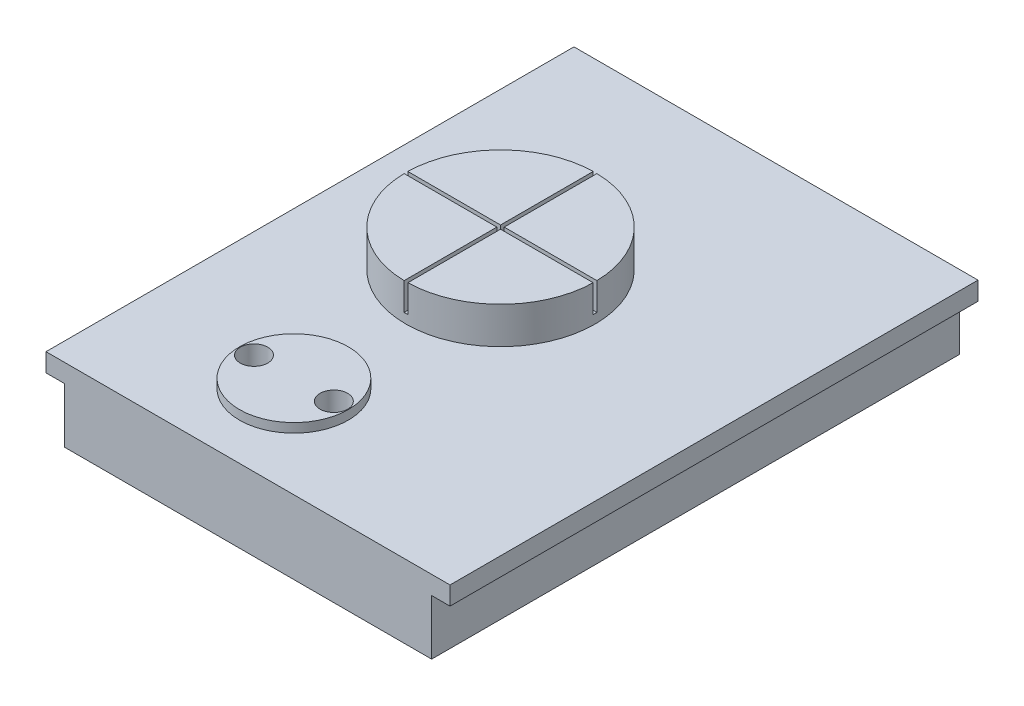
ISO-10303-21;
HEADER;
FILE_DESCRIPTION(('STEP AP214'),'2;1');
FILE_NAME('part.step','',(''),(''),'','','');
FILE_SCHEMA(('AUTOMOTIVE_DESIGN { 1 0 10303 214 1 1 1 1 }'));
ENDSEC;
DATA;
#1=APPLICATION_CONTEXT('core data for automotive mechanical design processes');
#2=APPLICATION_PROTOCOL_DEFINITION('international standard','automotive_design',2000,#1);
#3=PRODUCT_CONTEXT('',#1,'mechanical');
#4=PRODUCT('Part','Part','',(#3));
#5=PRODUCT_RELATED_PRODUCT_CATEGORY('part','',(#4));
#6=PRODUCT_DEFINITION_FORMATION('','',#4);
#7=PRODUCT_DEFINITION_CONTEXT('part definition',#1,'design');
#8=PRODUCT_DEFINITION('design','',#6,#7);
#9=PRODUCT_DEFINITION_SHAPE('','',#8);
#10=(LENGTH_UNIT() NAMED_UNIT(*) SI_UNIT(.MILLI.,.METRE.));
#11=(NAMED_UNIT(*) PLANE_ANGLE_UNIT() SI_UNIT($,.RADIAN.));
#12=(NAMED_UNIT(*) SI_UNIT($,.STERADIAN.) SOLID_ANGLE_UNIT());
#13=UNCERTAINTY_MEASURE_WITH_UNIT(LENGTH_MEASURE(1.E-05),#10,'distance_accuracy_value','');
#14=(GEOMETRIC_REPRESENTATION_CONTEXT(3) GLOBAL_UNCERTAINTY_ASSIGNED_CONTEXT((#13)) GLOBAL_UNIT_ASSIGNED_CONTEXT((#10,
#11,#12)) REPRESENTATION_CONTEXT('',''));
#15=CARTESIAN_POINT('',(0.,0.,0.));
#16=DIRECTION('',(0.,0.,1.));
#17=DIRECTION('',(1.,0.,0.));
#18=AXIS2_PLACEMENT_3D('',#15,#16,#17);
#19=CARTESIAN_POINT('',(0.,4.,-22.5));
#20=DIRECTION('',(0.,-1.,0.));
#21=DIRECTION('',(0.,0.,-1.));
#22=AXIS2_PLACEMENT_3D('',#19,#20,#21);
#23=CYLINDRICAL_SURFACE('',#22,10.3);
#24=CARTESIAN_POINT('',(0.,4.,-22.5));
#25=DIRECTION('',(0.,1.,0.));
#26=DIRECTION('',(0.,0.,1.));
#27=AXIS2_PLACEMENT_3D('',#24,#25,#26);
#28=CIRCLE('',#27,10.3);
#29=CARTESIAN_POINT('',(0.2,4.,-12.2019419306357));
#30=VERTEX_POINT('',#29);
#31=CARTESIAN_POINT('',(10.2980580693643,4.,-22.3));
#32=VERTEX_POINT('',#31);
#33=EDGE_CURVE('E277',#30,#32,#28,.T.);
#34=ORIENTED_EDGE('',*,*,#33,.F.);
#35=DIRECTION('',(0.,-1.,0.));
#36=VECTOR('',#35,1.);
#37=CARTESIAN_POINT('',(0.2,4.,-12.2019419306357));
#38=LINE('',#37,#36);
#39=CARTESIAN_POINT('',(0.2,1.,-12.2019419306357));
#40=VERTEX_POINT('',#39);
#41=EDGE_CURVE('E343',#30,#40,#38,.T.);
#42=ORIENTED_EDGE('',*,*,#41,.T.);
#43=CARTESIAN_POINT('',(0.,1.,-22.5));
#44=DIRECTION('',(0.,-1.,0.));
#45=DIRECTION('',(0.,0.,-1.));
#46=AXIS2_PLACEMENT_3D('',#43,#44,#45);
#47=CIRCLE('',#46,10.3);
#48=CARTESIAN_POINT('',(-0.2,1.,-12.2019419306357));
#49=VERTEX_POINT('',#48);
#50=EDGE_CURVE('E12',#40,#49,#47,.T.);
#51=ORIENTED_EDGE('',*,*,#50,.T.);
#52=DIRECTION('',(0.,-1.,0.));
#53=VECTOR('',#52,1.);
#54=CARTESIAN_POINT('',(-0.2,4.,-12.2019419306357));
#55=LINE('',#54,#53);
#56=CARTESIAN_POINT('',(-0.2,4.,-12.2019419306357));
#57=VERTEX_POINT('',#56);
#58=EDGE_CURVE('E346',#57,#49,#55,.T.);
#59=ORIENTED_EDGE('',*,*,#58,.F.);
#60=CARTESIAN_POINT('',(-10.2980580693643,4.,-22.3));
#61=VERTEX_POINT('',#60);
#62=EDGE_CURVE('E306',#61,#57,#28,.T.);
#63=ORIENTED_EDGE('',*,*,#62,.F.);
#64=DIRECTION('',(0.,-1.,0.));
#65=VECTOR('',#64,1.);
#66=CARTESIAN_POINT('',(-10.2980580693643,4.,-22.3));
#67=LINE('',#66,#65);
#68=CARTESIAN_POINT('',(-10.2980580693643,1.,-22.3));
#69=VERTEX_POINT('',#68);
#70=EDGE_CURVE('E350',#61,#69,#67,.T.);
#71=ORIENTED_EDGE('',*,*,#70,.T.);
#72=CARTESIAN_POINT('',(-10.2980580693643,1.,-22.7));
#73=VERTEX_POINT('',#72);
#74=EDGE_CURVE('E231',#69,#73,#47,.T.);
#75=ORIENTED_EDGE('',*,*,#74,.T.);
#76=DIRECTION('',(0.,-1.,0.));
#77=VECTOR('',#76,1.);
#78=CARTESIAN_POINT('',(-10.2980580693643,4.,-22.7));
#79=LINE('',#78,#77);
#80=CARTESIAN_POINT('',(-10.2980580693643,4.,-22.7));
#81=VERTEX_POINT('',#80);
#82=EDGE_CURVE('E348',#81,#73,#79,.T.);
#83=ORIENTED_EDGE('',*,*,#82,.F.);
#84=CARTESIAN_POINT('',(-0.2,4.,-32.7980580693643));
#85=VERTEX_POINT('',#84);
#86=EDGE_CURVE('E228',#85,#81,#28,.T.);
#87=ORIENTED_EDGE('',*,*,#86,.F.);
#88=DIRECTION('',(0.,-1.,0.));
#89=VECTOR('',#88,1.);
#90=CARTESIAN_POINT('',(-0.2,4.,-32.7980580693643));
#91=LINE('',#90,#89);
#92=CARTESIAN_POINT('',(-0.2,1.,-32.7980580693643));
#93=VERTEX_POINT('',#92);
#94=EDGE_CURVE('E209',#93,#85,#91,.F.);
#95=ORIENTED_EDGE('',*,*,#94,.F.);
#96=CARTESIAN_POINT('',(0.2,1.,-32.7980580693643));
#97=VERTEX_POINT('',#96);
#98=EDGE_CURVE('E72',#93,#97,#47,.T.);
#99=ORIENTED_EDGE('',*,*,#98,.T.);
#100=DIRECTION('',(0.,-1.,0.));
#101=VECTOR('',#100,1.);
#102=CARTESIAN_POINT('',(0.2,4.,-32.7980580693643));
#103=LINE('',#102,#101);
#104=CARTESIAN_POINT('',(0.2,4.,-32.7980580693643));
#105=VERTEX_POINT('',#104);
#106=EDGE_CURVE('E326',#97,#105,#103,.F.);
#107=ORIENTED_EDGE('',*,*,#106,.T.);
#108=CARTESIAN_POINT('',(10.2980580693643,4.,-22.7));
#109=VERTEX_POINT('',#108);
#110=EDGE_CURVE('E395',#109,#105,#28,.T.);
#111=ORIENTED_EDGE('',*,*,#110,.F.);
#112=DIRECTION('',(0.,-1.,0.));
#113=VECTOR('',#112,1.);
#114=CARTESIAN_POINT('',(10.2980580693643,4.,-22.7));
#115=LINE('',#114,#113);
#116=CARTESIAN_POINT('',(10.2980580693643,1.,-22.7));
#117=VERTEX_POINT('',#116);
#118=EDGE_CURVE('E79',#117,#109,#115,.F.);
#119=ORIENTED_EDGE('',*,*,#118,.F.);
#120=CARTESIAN_POINT('',(10.2980580693643,1.,-22.3));
#121=VERTEX_POINT('',#120);
#122=EDGE_CURVE('E67',#117,#121,#47,.T.);
#123=ORIENTED_EDGE('',*,*,#122,.T.);
#124=DIRECTION('',(0.,-1.,0.));
#125=VECTOR('',#124,1.);
#126=CARTESIAN_POINT('',(10.2980580693643,4.,-22.3));
#127=LINE('',#126,#125);
#128=EDGE_CURVE('E353',#121,#32,#127,.F.);
#129=ORIENTED_EDGE('',*,*,#128,.T.);
#130=EDGE_LOOP('',(#34,#42,#51,#59,#63,#71,#75,#83,#87,#95,#99,#107,#111,#119,#123,#129));
#131=FACE_BOUND('',#130,.T.);
#132=CARTESIAN_POINT('',(0.,0.,-22.5));
#133=DIRECTION('',(0.,1.,0.));
#134=DIRECTION('',(0.,0.,1.));
#135=AXIS2_PLACEMENT_3D('',#132,#133,#134);
#136=CIRCLE('',#135,10.3);
#137=CARTESIAN_POINT('',(0.,0.,-12.2));
#138=VERTEX_POINT('',#137);
#139=EDGE_CURVE('E303',#138,#138,#136,.T.);
#140=ORIENTED_EDGE('',*,*,#139,.T.);
#141=EDGE_LOOP('',(#140));
#142=FACE_BOUND('',#141,.T.);
#143=ADVANCED_FACE('F63',(#131,#142),#23,.T.);
#144=CARTESIAN_POINT('',(0.,4.,0.));
#145=DIRECTION('',(0.,1.,0.));
#146=DIRECTION('',(0.,0.,1.));
#147=AXIS2_PLACEMENT_3D('',#144,#145,#146);
#148=PLANE('',#147);
#149=DIRECTION('',(1.,0.,0.));
#150=VECTOR('',#149,1.);
#151=CARTESIAN_POINT('',(0.,4.,-22.7));
#152=LINE('',#151,#150);
#153=CARTESIAN_POINT('',(-0.200000000000001,4.,-22.7));
#154=VERTEX_POINT('',#153);
#155=EDGE_CURVE('E220',#81,#154,#152,.T.);
#156=ORIENTED_EDGE('',*,*,#155,.T.);
#157=DIRECTION('',(0.,0.,-1.));
#158=VECTOR('',#157,1.);
#159=CARTESIAN_POINT('',(-0.2,4.,-12.2));
#160=LINE('',#159,#158);
#161=EDGE_CURVE('E203',#154,#85,#160,.T.);
#162=ORIENTED_EDGE('',*,*,#161,.T.);
#163=ORIENTED_EDGE('',*,*,#86,.T.);
#164=EDGE_LOOP('',(#156,#162,#163));
#165=FACE_BOUND('',#164,.T.);
#166=ADVANCED_FACE('F227',(#165),#148,.T.);
#167=ORIENTED_EDGE('',*,*,#62,.T.);
#168=DIRECTION('',(0.,0.,-1.));
#169=VECTOR('',#168,1.);
#170=CARTESIAN_POINT('',(-0.2,4.,0.));
#171=LINE('',#170,#169);
#172=CARTESIAN_POINT('',(-0.2,4.,-22.3));
#173=VERTEX_POINT('',#172);
#174=EDGE_CURVE('E229',#57,#173,#171,.T.);
#175=ORIENTED_EDGE('',*,*,#174,.T.);
#176=DIRECTION('',(1.,0.,0.));
#177=VECTOR('',#176,1.);
#178=CARTESIAN_POINT('',(0.,4.,-22.3));
#179=LINE('',#178,#177);
#180=EDGE_CURVE('E233',#61,#173,#179,.T.);
#181=ORIENTED_EDGE('',*,*,#180,.F.);
#182=EDGE_LOOP('',(#167,#175,#181));
#183=FACE_BOUND('',#182,.T.);
#184=ADVANCED_FACE('F424',(#183),#148,.T.);
#185=DIRECTION('',(0.,0.,-1.));
#186=VECTOR('',#185,1.);
#187=CARTESIAN_POINT('',(0.2,4.,0.));
#188=LINE('',#187,#186);
#189=CARTESIAN_POINT('',(0.200000000000001,4.,-22.3));
#190=VERTEX_POINT('',#189);
#191=EDGE_CURVE('E237',#30,#190,#188,.T.);
#192=ORIENTED_EDGE('',*,*,#191,.F.);
#193=ORIENTED_EDGE('',*,*,#33,.T.);
#194=DIRECTION('',(1.,0.,0.));
#195=VECTOR('',#194,1.);
#196=CARTESIAN_POINT('',(-10.3,4.,-22.3));
#197=LINE('',#196,#195);
#198=EDGE_CURVE('E374',#190,#32,#197,.T.);
#199=ORIENTED_EDGE('',*,*,#198,.F.);
#200=EDGE_LOOP('',(#192,#193,#199));
#201=FACE_BOUND('',#200,.T.);
#202=ADVANCED_FACE('F402',(#201),#148,.T.);
#203=CARTESIAN_POINT('',(-4.35,-8.,0.));
#204=DIRECTION('',(0.,1.,0.));
#205=DIRECTION('',(0.,0.,1.));
#206=AXIS2_PLACEMENT_3D('',#203,#204,#205);
#207=CYLINDRICAL_SURFACE('',#206,1.5);
#208=CARTESIAN_POINT('',(-4.35,1.,0.));
#209=DIRECTION('',(0.,1.,0.));
#210=DIRECTION('',(0.,0.,1.));
#211=AXIS2_PLACEMENT_3D('',#208,#209,#210);
#212=CIRCLE('',#211,1.5);
#213=CARTESIAN_POINT('',(-4.35,1.,1.5));
#214=VERTEX_POINT('',#213);
#215=EDGE_CURVE('E313',#214,#214,#212,.T.);
#216=ORIENTED_EDGE('',*,*,#215,.T.);
#217=EDGE_LOOP('',(#216));
#218=FACE_BOUND('',#217,.T.);
#219=CARTESIAN_POINT('',(-4.35,-2.,0.));
#220=DIRECTION('',(0.,-1.,0.));
#221=DIRECTION('',(0.,0.,-1.));
#222=AXIS2_PLACEMENT_3D('',#219,#220,#221);
#223=CIRCLE('',#222,1.5);
#224=CARTESIAN_POINT('',(-4.35,-2.,-1.5));
#225=VERTEX_POINT('',#224);
#226=EDGE_CURVE('E335',#225,#225,#223,.F.);
#227=ORIENTED_EDGE('',*,*,#226,.F.);
#228=EDGE_LOOP('',(#227));
#229=FACE_BOUND('',#228,.T.);
#230=ADVANCED_FACE('F456',(#218,#229),#207,.F.);
#231=CARTESIAN_POINT('',(4.35,-8.,0.));
#232=DIRECTION('',(0.,1.,0.));
#233=DIRECTION('',(0.,0.,1.));
#234=AXIS2_PLACEMENT_3D('',#231,#232,#233);
#235=CYLINDRICAL_SURFACE('',#234,1.5);
#236=CARTESIAN_POINT('',(4.35,1.,0.));
#237=DIRECTION('',(0.,1.,0.));
#238=DIRECTION('',(0.,0.,1.));
#239=AXIS2_PLACEMENT_3D('',#236,#237,#238);
#240=CIRCLE('',#239,1.5);
#241=CARTESIAN_POINT('',(4.35,1.,1.5));
#242=VERTEX_POINT('',#241);
#243=EDGE_CURVE('E317',#242,#242,#240,.T.);
#244=ORIENTED_EDGE('',*,*,#243,.T.);
#245=EDGE_LOOP('',(#244));
#246=FACE_BOUND('',#245,.T.);
#247=CARTESIAN_POINT('',(4.35,-2.,0.));
#248=DIRECTION('',(0.,-1.,0.));
#249=DIRECTION('',(0.,0.,-1.));
#250=AXIS2_PLACEMENT_3D('',#247,#248,#249);
#251=CIRCLE('',#250,1.5);
#252=CARTESIAN_POINT('',(4.35,-2.,-1.5));
#253=VERTEX_POINT('',#252);
#254=EDGE_CURVE('E325',#253,#253,#251,.F.);
#255=ORIENTED_EDGE('',*,*,#254,.F.);
#256=EDGE_LOOP('',(#255));
#257=FACE_BOUND('',#256,.T.);
#258=ADVANCED_FACE('F453',(#246,#257),#235,.F.);
#259=CARTESIAN_POINT('',(0.,-8.,10.));
#260=DIRECTION('',(0.,0.,1.));
#261=DIRECTION('',(1.,0.,0.));
#262=AXIS2_PLACEMENT_3D('',#259,#260,#261);
#263=PLANE('',#262);
#264=DIRECTION('',(1.,0.,0.));
#265=VECTOR('',#264,1.);
#266=CARTESIAN_POINT('',(0.,0.,10.));
#267=LINE('',#266,#265);
#268=CARTESIAN_POINT('',(-17.,0.,10.));
#269=VERTEX_POINT('',#268);
#270=CARTESIAN_POINT('',(27.,0.,10.));
#271=VERTEX_POINT('',#270);
#272=EDGE_CURVE('E254',#269,#271,#267,.T.);
#273=ORIENTED_EDGE('',*,*,#272,.F.);
#274=DIRECTION('',(0.,1.,0.));
#275=VECTOR('',#274,1.);
#276=CARTESIAN_POINT('',(-17.,-2.,10.));
#277=LINE('',#276,#275);
#278=CARTESIAN_POINT('',(-17.,-2.,10.));
#279=VERTEX_POINT('',#278);
#280=EDGE_CURVE('E287',#279,#269,#277,.T.);
#281=ORIENTED_EDGE('',*,*,#280,.F.);
#282=DIRECTION('',(1.,0.,0.));
#283=VECTOR('',#282,1.);
#284=CARTESIAN_POINT('',(0.,-2.,10.));
#285=LINE('',#284,#283);
#286=CARTESIAN_POINT('',(-15.,-2.,10.));
#287=VERTEX_POINT('',#286);
#288=EDGE_CURVE('E298',#279,#287,#285,.T.);
#289=ORIENTED_EDGE('',*,*,#288,.T.);
#290=DIRECTION('',(0.,1.,0.));
#291=VECTOR('',#290,1.);
#292=CARTESIAN_POINT('',(-15.,-8.,10.));
#293=LINE('',#292,#291);
#294=CARTESIAN_POINT('',(-15.,-8.,10.));
#295=VERTEX_POINT('',#294);
#296=EDGE_CURVE('E239',#295,#287,#293,.T.);
#297=ORIENTED_EDGE('',*,*,#296,.F.);
#298=DIRECTION('',(1.,0.,0.));
#299=VECTOR('',#298,1.);
#300=CARTESIAN_POINT('',(0.,-8.,10.));
#301=LINE('',#300,#299);
#302=CARTESIAN_POINT('',(25.,-8.,10.));
#303=VERTEX_POINT('',#302);
#304=EDGE_CURVE('E253',#295,#303,#301,.T.);
#305=ORIENTED_EDGE('',*,*,#304,.T.);
#306=DIRECTION('',(0.,1.,0.));
#307=VECTOR('',#306,1.);
#308=CARTESIAN_POINT('',(25.,-8.,10.));
#309=LINE('',#308,#307);
#310=CARTESIAN_POINT('',(25.,-2.,10.));
#311=VERTEX_POINT('',#310);
#312=EDGE_CURVE('E240',#303,#311,#309,.T.);
#313=ORIENTED_EDGE('',*,*,#312,.T.);
#314=DIRECTION('',(1.,0.,0.));
#315=VECTOR('',#314,1.);
#316=CARTESIAN_POINT('',(0.,-2.,10.));
#317=LINE('',#316,#315);
#318=CARTESIAN_POINT('',(27.,-2.,10.));
#319=VERTEX_POINT('',#318);
#320=EDGE_CURVE('E276',#311,#319,#317,.T.);
#321=ORIENTED_EDGE('',*,*,#320,.T.);
#322=DIRECTION('',(0.,1.,0.));
#323=VECTOR('',#322,1.);
#324=CARTESIAN_POINT('',(27.,-2.,10.));
#325=LINE('',#324,#323);
#326=EDGE_CURVE('E265',#319,#271,#325,.T.);
#327=ORIENTED_EDGE('',*,*,#326,.T.);
#328=EDGE_LOOP('',(#273,#281,#289,#297,#305,#313,#321,#327));
#329=FACE_BOUND('',#328,.T.);
#330=ADVANCED_FACE('F65',(#329),#263,.T.);
#331=CARTESIAN_POINT('',(-15.,-8.,0.));
#332=DIRECTION('',(1.,0.,0.));
#333=DIRECTION('',(0.,0.,-1.));
#334=AXIS2_PLACEMENT_3D('',#331,#332,#333);
#335=PLANE('',#334);
#336=ORIENTED_EDGE('',*,*,#296,.T.);
#337=DIRECTION('',(0.,0.,-1.));
#338=VECTOR('',#337,1.);
#339=CARTESIAN_POINT('',(-15.,-2.,0.));
#340=LINE('',#339,#338);
#341=CARTESIAN_POINT('',(-15.,-2.,-47.5));
#342=VERTEX_POINT('',#341);
#343=EDGE_CURVE('E296',#287,#342,#340,.T.);
#344=ORIENTED_EDGE('',*,*,#343,.T.);
#345=DIRECTION('',(0.,1.,0.));
#346=VECTOR('',#345,1.);
#347=CARTESIAN_POINT('',(-15.,-8.,-47.5));
#348=LINE('',#347,#346);
#349=CARTESIAN_POINT('',(-15.,-8.,-47.5));
#350=VERTEX_POINT('',#349);
#351=EDGE_CURVE('E246',#350,#342,#348,.T.);
#352=ORIENTED_EDGE('',*,*,#351,.F.);
#353=DIRECTION('',(0.,0.,-1.));
#354=VECTOR('',#353,1.);
#355=CARTESIAN_POINT('',(-15.,-8.,0.));
#356=LINE('',#355,#354);
#357=EDGE_CURVE('E244',#295,#350,#356,.T.);
#358=ORIENTED_EDGE('',*,*,#357,.F.);
#359=EDGE_LOOP('',(#336,#344,#352,#358));
#360=FACE_BOUND('',#359,.T.);
#361=ADVANCED_FACE('F461',(#360),#335,.F.);
#362=CARTESIAN_POINT('',(0.,-8.,-47.5));
#363=DIRECTION('',(0.,0.,1.));
#364=DIRECTION('',(1.,0.,0.));
#365=AXIS2_PLACEMENT_3D('',#362,#363,#364);
#366=PLANE('',#365);
#367=DIRECTION('',(1.,0.,0.));
#368=VECTOR('',#367,1.);
#369=CARTESIAN_POINT('',(0.,0.,-47.5));
#370=LINE('',#369,#368);
#371=CARTESIAN_POINT('',(-17.,0.,-47.5));
#372=VERTEX_POINT('',#371);
#373=CARTESIAN_POINT('',(27.,0.,-47.5));
#374=VERTEX_POINT('',#373);
#375=EDGE_CURVE('E251',#372,#374,#370,.T.);
#376=ORIENTED_EDGE('',*,*,#375,.T.);
#377=DIRECTION('',(0.,1.,0.));
#378=VECTOR('',#377,1.);
#379=CARTESIAN_POINT('',(27.,-2.,-47.5));
#380=LINE('',#379,#378);
#381=CARTESIAN_POINT('',(27.,-2.,-47.5));
#382=VERTEX_POINT('',#381);
#383=EDGE_CURVE('E268',#382,#374,#380,.T.);
#384=ORIENTED_EDGE('',*,*,#383,.F.);
#385=DIRECTION('',(1.,0.,0.));
#386=VECTOR('',#385,1.);
#387=CARTESIAN_POINT('',(0.,-2.,-47.5));
#388=LINE('',#387,#386);
#389=CARTESIAN_POINT('',(25.,-2.,-47.5));
#390=VERTEX_POINT('',#389);
#391=EDGE_CURVE('E280',#390,#382,#388,.T.);
#392=ORIENTED_EDGE('',*,*,#391,.F.);
#393=DIRECTION('',(0.,1.,0.));
#394=VECTOR('',#393,1.);
#395=CARTESIAN_POINT('',(25.,-8.,-47.5));
#396=LINE('',#395,#394);
#397=CARTESIAN_POINT('',(25.,-8.,-47.5));
#398=VERTEX_POINT('',#397);
#399=EDGE_CURVE('E243',#398,#390,#396,.T.);
#400=ORIENTED_EDGE('',*,*,#399,.F.);
#401=DIRECTION('',(1.,0.,0.));
#402=VECTOR('',#401,1.);
#403=CARTESIAN_POINT('',(0.,-8.,-47.5));
#404=LINE('',#403,#402);
#405=EDGE_CURVE('E258',#350,#398,#404,.T.);
#406=ORIENTED_EDGE('',*,*,#405,.F.);
#407=ORIENTED_EDGE('',*,*,#351,.T.);
#408=DIRECTION('',(1.,0.,0.));
#409=VECTOR('',#408,1.);
#410=CARTESIAN_POINT('',(0.,-2.,-47.5));
#411=LINE('',#410,#409);
#412=CARTESIAN_POINT('',(-17.,-2.,-47.5));
#413=VERTEX_POINT('',#412);
#414=EDGE_CURVE('E87',#413,#342,#411,.T.);
#415=ORIENTED_EDGE('',*,*,#414,.F.);
#416=DIRECTION('',(0.,1.,0.));
#417=VECTOR('',#416,1.);
#418=CARTESIAN_POINT('',(-17.,-2.,-47.5));
#419=LINE('',#418,#417);
#420=EDGE_CURVE('E256',#413,#372,#419,.T.);
#421=ORIENTED_EDGE('',*,*,#420,.T.);
#422=EDGE_LOOP('',(#376,#384,#392,#400,#406,#407,#415,#421));
#423=FACE_BOUND('',#422,.T.);
#424=ADVANCED_FACE('F464',(#423),#366,.F.);
#425=CARTESIAN_POINT('',(25.,-8.,0.));
#426=DIRECTION('',(1.,0.,0.));
#427=DIRECTION('',(0.,0.,-1.));
#428=AXIS2_PLACEMENT_3D('',#425,#426,#427);
#429=PLANE('',#428);
#430=DIRECTION('',(0.,0.,-1.));
#431=VECTOR('',#430,1.);
#432=CARTESIAN_POINT('',(25.,-2.,0.));
#433=LINE('',#432,#431);
#434=EDGE_CURVE('E269',#311,#390,#433,.T.);
#435=ORIENTED_EDGE('',*,*,#434,.F.);
#436=ORIENTED_EDGE('',*,*,#312,.F.);
#437=DIRECTION('',(0.,0.,-1.));
#438=VECTOR('',#437,1.);
#439=CARTESIAN_POINT('',(25.,-8.,0.));
#440=LINE('',#439,#438);
#441=EDGE_CURVE('E260',#303,#398,#440,.T.);
#442=ORIENTED_EDGE('',*,*,#441,.T.);
#443=ORIENTED_EDGE('',*,*,#399,.T.);
#444=EDGE_LOOP('',(#435,#436,#442,#443));
#445=FACE_BOUND('',#444,.T.);
#446=ADVANCED_FACE('F448',(#445),#429,.T.);
#447=CARTESIAN_POINT('',(0.,-8.,0.));
#448=DIRECTION('',(0.,1.,0.));
#449=DIRECTION('',(0.,0.,1.));
#450=AXIS2_PLACEMENT_3D('',#447,#448,#449);
#451=PLANE('',#450);
#452=CARTESIAN_POINT('',(-4.35,-8.,0.));
#453=DIRECTION('',(0.,-1.,0.));
#454=DIRECTION('',(0.,0.,-1.));
#455=AXIS2_PLACEMENT_3D('',#452,#453,#454);
#456=CIRCLE('',#455,1.9);
#457=CARTESIAN_POINT('',(-4.35,-8.,-1.9));
#458=VERTEX_POINT('',#457);
#459=EDGE_CURVE('E330',#458,#458,#456,.T.);
#460=ORIENTED_EDGE('',*,*,#459,.F.);
#461=EDGE_LOOP('',(#460));
#462=FACE_BOUND('',#461,.T.);
#463=CARTESIAN_POINT('',(4.35,-8.,0.));
#464=DIRECTION('',(0.,-1.,0.));
#465=DIRECTION('',(0.,0.,-1.));
#466=AXIS2_PLACEMENT_3D('',#463,#464,#465);
#467=CIRCLE('',#466,1.9);
#468=CARTESIAN_POINT('',(4.35,-8.,-1.9));
#469=VERTEX_POINT('',#468);
#470=EDGE_CURVE('E322',#469,#469,#467,.T.);
#471=ORIENTED_EDGE('',*,*,#470,.F.);
#472=EDGE_LOOP('',(#471));
#473=FACE_BOUND('',#472,.T.);
#474=ORIENTED_EDGE('',*,*,#304,.F.);
#475=ORIENTED_EDGE('',*,*,#357,.T.);
#476=ORIENTED_EDGE('',*,*,#405,.T.);
#477=ORIENTED_EDGE('',*,*,#441,.F.);
#478=EDGE_LOOP('',(#474,#475,#476,#477));
#479=FACE_BOUND('',#478,.T.);
#480=ADVANCED_FACE('F445',(#462,#473,#479),#451,.F.);
#481=CARTESIAN_POINT('',(0.,0.,0.));
#482=DIRECTION('',(0.,1.,0.));
#483=DIRECTION('',(0.,0.,1.));
#484=AXIS2_PLACEMENT_3D('',#481,#482,#483);
#485=PLANE('',#484);
#486=CARTESIAN_POINT('',(0.,0.,0.));
#487=DIRECTION('',(0.,1.,0.));
#488=DIRECTION('',(0.,0.,1.));
#489=AXIS2_PLACEMENT_3D('',#486,#487,#488);
#490=CIRCLE('',#489,5.925);
#491=CARTESIAN_POINT('',(0.,0.,5.925));
#492=VERTEX_POINT('',#491);
#493=EDGE_CURVE('E310',#492,#492,#490,.T.);
#494=ORIENTED_EDGE('',*,*,#493,.F.);
#495=EDGE_LOOP('',(#494));
#496=FACE_BOUND('',#495,.T.);
#497=ORIENTED_EDGE('',*,*,#139,.F.);
#498=EDGE_LOOP('',(#497));
#499=FACE_BOUND('',#498,.T.);
#500=ORIENTED_EDGE('',*,*,#272,.T.);
#501=DIRECTION('',(0.,0.,-1.));
#502=VECTOR('',#501,1.);
#503=CARTESIAN_POINT('',(27.,0.,0.));
#504=LINE('',#503,#502);
#505=EDGE_CURVE('E273',#271,#374,#504,.T.);
#506=ORIENTED_EDGE('',*,*,#505,.T.);
#507=ORIENTED_EDGE('',*,*,#375,.F.);
#508=DIRECTION('',(0.,0.,1.));
#509=VECTOR('',#508,1.);
#510=CARTESIAN_POINT('',(-17.,0.,0.));
#511=LINE('',#510,#509);
#512=EDGE_CURVE('E272',#372,#269,#511,.T.);
#513=ORIENTED_EDGE('',*,*,#512,.T.);
#514=EDGE_LOOP('',(#500,#506,#507,#513));
#515=FACE_BOUND('',#514,.T.);
#516=ADVANCED_FACE('F443',(#496,#499,#515),#485,.T.);
#517=CARTESIAN_POINT('',(27.,-2.,0.));
#518=DIRECTION('',(1.,0.,0.));
#519=DIRECTION('',(0.,0.,-1.));
#520=AXIS2_PLACEMENT_3D('',#517,#518,#519);
#521=PLANE('',#520);
#522=ORIENTED_EDGE('',*,*,#505,.F.);
#523=ORIENTED_EDGE('',*,*,#326,.F.);
#524=DIRECTION('',(0.,0.,-1.));
#525=VECTOR('',#524,1.);
#526=CARTESIAN_POINT('',(27.,-2.,0.));
#527=LINE('',#526,#525);
#528=EDGE_CURVE('E282',#319,#382,#527,.T.);
#529=ORIENTED_EDGE('',*,*,#528,.T.);
#530=ORIENTED_EDGE('',*,*,#383,.T.);
#531=EDGE_LOOP('',(#522,#523,#529,#530));
#532=FACE_BOUND('',#531,.T.);
#533=ADVANCED_FACE('F439',(#532),#521,.T.);
#534=CARTESIAN_POINT('',(0.,-2.,0.));
#535=DIRECTION('',(0.,1.,0.));
#536=DIRECTION('',(0.,0.,1.));
#537=AXIS2_PLACEMENT_3D('',#534,#535,#536);
#538=PLANE('',#537);
#539=ORIENTED_EDGE('',*,*,#320,.F.);
#540=ORIENTED_EDGE('',*,*,#434,.T.);
#541=ORIENTED_EDGE('',*,*,#391,.T.);
#542=ORIENTED_EDGE('',*,*,#528,.F.);
#543=EDGE_LOOP('',(#539,#540,#541,#542));
#544=FACE_BOUND('',#543,.T.);
#545=ADVANCED_FACE('F435',(#544),#538,.F.);
#546=CARTESIAN_POINT('',(-17.,-2.,0.));
#547=DIRECTION('',(-1.,0.,0.));
#548=DIRECTION('',(0.,0.,1.));
#549=AXIS2_PLACEMENT_3D('',#546,#547,#548);
#550=PLANE('',#549);
#551=ORIENTED_EDGE('',*,*,#512,.F.);
#552=ORIENTED_EDGE('',*,*,#420,.F.);
#553=DIRECTION('',(0.,0.,1.));
#554=VECTOR('',#553,1.);
#555=CARTESIAN_POINT('',(-17.,-2.,0.));
#556=LINE('',#555,#554);
#557=EDGE_CURVE('E294',#413,#279,#556,.T.);
#558=ORIENTED_EDGE('',*,*,#557,.T.);
#559=ORIENTED_EDGE('',*,*,#280,.T.);
#560=EDGE_LOOP('',(#551,#552,#558,#559));
#561=FACE_BOUND('',#560,.T.);
#562=ADVANCED_FACE('F432',(#561),#550,.T.);
#563=CARTESIAN_POINT('',(0.,-2.,0.));
#564=DIRECTION('',(0.,1.,0.));
#565=DIRECTION('',(0.,0.,1.));
#566=AXIS2_PLACEMENT_3D('',#563,#564,#565);
#567=PLANE('',#566);
#568=ORIENTED_EDGE('',*,*,#557,.F.);
#569=ORIENTED_EDGE('',*,*,#414,.T.);
#570=ORIENTED_EDGE('',*,*,#343,.F.);
#571=ORIENTED_EDGE('',*,*,#288,.F.);
#572=EDGE_LOOP('',(#568,#569,#570,#571));
#573=FACE_BOUND('',#572,.T.);
#574=ADVANCED_FACE('F429',(#573),#567,.F.);
#575=DIRECTION('',(0.,0.,-1.));
#576=VECTOR('',#575,1.);
#577=CARTESIAN_POINT('',(0.2,4.,-12.2));
#578=LINE('',#577,#576);
#579=CARTESIAN_POINT('',(0.2,4.,-22.7));
#580=VERTEX_POINT('',#579);
#581=EDGE_CURVE('E215',#580,#105,#578,.T.);
#582=ORIENTED_EDGE('',*,*,#581,.F.);
#583=DIRECTION('',(1.,0.,0.));
#584=VECTOR('',#583,1.);
#585=CARTESIAN_POINT('',(-10.3,4.,-22.7));
#586=LINE('',#585,#584);
#587=EDGE_CURVE('E371',#580,#109,#586,.T.);
#588=ORIENTED_EDGE('',*,*,#587,.T.);
#589=ORIENTED_EDGE('',*,*,#110,.T.);
#590=EDGE_LOOP('',(#582,#588,#589));
#591=FACE_BOUND('',#590,.T.);
#592=ADVANCED_FACE('F426',(#591),#148,.T.);
#593=CARTESIAN_POINT('',(0.,1.,0.));
#594=DIRECTION('',(0.,-1.,0.));
#595=DIRECTION('',(0.,0.,-1.));
#596=AXIS2_PLACEMENT_3D('',#593,#594,#595);
#597=CYLINDRICAL_SURFACE('',#596,5.925);
#598=CARTESIAN_POINT('',(0.,1.,0.));
#599=DIRECTION('',(0.,1.,0.));
#600=DIRECTION('',(0.,0.,1.));
#601=AXIS2_PLACEMENT_3D('',#598,#599,#600);
#602=CIRCLE('',#601,5.925);
#603=CARTESIAN_POINT('',(0.,1.,5.925));
#604=VERTEX_POINT('',#603);
#605=EDGE_CURVE('E307',#604,#604,#602,.T.);
#606=ORIENTED_EDGE('',*,*,#605,.F.);
#607=EDGE_LOOP('',(#606));
#608=FACE_BOUND('',#607,.T.);
#609=ORIENTED_EDGE('',*,*,#493,.T.);
#610=EDGE_LOOP('',(#609));
#611=FACE_BOUND('',#610,.T.);
#612=ADVANCED_FACE('F550',(#608,#611),#597,.T.);
#613=CARTESIAN_POINT('',(0.,1.,0.));
#614=DIRECTION('',(0.,1.,0.));
#615=DIRECTION('',(0.,0.,1.));
#616=AXIS2_PLACEMENT_3D('',#613,#614,#615);
#617=PLANE('',#616);
#618=ORIENTED_EDGE('',*,*,#215,.F.);
#619=EDGE_LOOP('',(#618));
#620=FACE_BOUND('',#619,.T.);
#621=ORIENTED_EDGE('',*,*,#243,.F.);
#622=EDGE_LOOP('',(#621));
#623=FACE_BOUND('',#622,.T.);
#624=ORIENTED_EDGE('',*,*,#605,.T.);
#625=EDGE_LOOP('',(#624));
#626=FACE_BOUND('',#625,.T.);
#627=ADVANCED_FACE('F559',(#620,#623,#626),#617,.T.);
#628=CARTESIAN_POINT('',(4.35,-2.,0.));
#629=DIRECTION('',(0.,-1.,0.));
#630=DIRECTION('',(0.,0.,-1.));
#631=AXIS2_PLACEMENT_3D('',#628,#629,#630);
#632=CYLINDRICAL_SURFACE('',#631,1.9);
#633=CARTESIAN_POINT('',(4.35,-2.,0.));
#634=DIRECTION('',(0.,-1.,0.));
#635=DIRECTION('',(0.,0.,-1.));
#636=AXIS2_PLACEMENT_3D('',#633,#634,#635);
#637=CIRCLE('',#636,1.9);
#638=CARTESIAN_POINT('',(4.35,-2.,-1.9));
#639=VERTEX_POINT('',#638);
#640=EDGE_CURVE('E327',#639,#639,#637,.T.);
#641=ORIENTED_EDGE('',*,*,#640,.F.);
#642=EDGE_LOOP('',(#641));
#643=FACE_BOUND('',#642,.T.);
#644=ORIENTED_EDGE('',*,*,#470,.T.);
#645=EDGE_LOOP('',(#644));
#646=FACE_BOUND('',#645,.T.);
#647=ADVANCED_FACE('F568',(#643,#646),#632,.F.);
#648=CARTESIAN_POINT('',(0.,-2.,0.));
#649=DIRECTION('',(0.,-1.,0.));
#650=DIRECTION('',(0.,0.,-1.));
#651=AXIS2_PLACEMENT_3D('',#648,#649,#650);
#652=PLANE('',#651);
#653=ORIENTED_EDGE('',*,*,#254,.T.);
#654=EDGE_LOOP('',(#653));
#655=FACE_BOUND('',#654,.T.);
#656=ORIENTED_EDGE('',*,*,#640,.T.);
#657=EDGE_LOOP('',(#656));
#658=FACE_BOUND('',#657,.T.);
#659=ADVANCED_FACE('F594',(#655,#658),#652,.T.);
#660=CARTESIAN_POINT('',(-4.35,-2.,0.));
#661=DIRECTION('',(0.,-1.,0.));
#662=DIRECTION('',(0.,0.,-1.));
#663=AXIS2_PLACEMENT_3D('',#660,#661,#662);
#664=CYLINDRICAL_SURFACE('',#663,1.9);
#665=CARTESIAN_POINT('',(-4.35,-2.,0.));
#666=DIRECTION('',(0.,-1.,0.));
#667=DIRECTION('',(0.,0.,-1.));
#668=AXIS2_PLACEMENT_3D('',#665,#666,#667);
#669=CIRCLE('',#668,1.9);
#670=CARTESIAN_POINT('',(-4.35,-2.,-1.9));
#671=VERTEX_POINT('',#670);
#672=EDGE_CURVE('E314',#671,#671,#669,.T.);
#673=ORIENTED_EDGE('',*,*,#672,.F.);
#674=EDGE_LOOP('',(#673));
#675=FACE_BOUND('',#674,.T.);
#676=ORIENTED_EDGE('',*,*,#459,.T.);
#677=EDGE_LOOP('',(#676));
#678=FACE_BOUND('',#677,.T.);
#679=ADVANCED_FACE('F604',(#675,#678),#664,.F.);
#680=CARTESIAN_POINT('',(0.,-2.,0.));
#681=DIRECTION('',(0.,-1.,0.));
#682=DIRECTION('',(0.,0.,-1.));
#683=AXIS2_PLACEMENT_3D('',#680,#681,#682);
#684=PLANE('',#683);
#685=ORIENTED_EDGE('',*,*,#226,.T.);
#686=EDGE_LOOP('',(#685));
#687=FACE_BOUND('',#686,.T.);
#688=ORIENTED_EDGE('',*,*,#672,.T.);
#689=EDGE_LOOP('',(#688));
#690=FACE_BOUND('',#689,.T.);
#691=ADVANCED_FACE('F614',(#687,#690),#684,.T.);
#692=CARTESIAN_POINT('',(0.,1.,0.));
#693=DIRECTION('',(0.,-1.,0.));
#694=DIRECTION('',(-1.,0.,0.));
#695=AXIS2_PLACEMENT_3D('',#692,#693,#694);
#696=PLANE('',#695);
#697=DIRECTION('',(1.,0.,0.));
#698=VECTOR('',#697,1.);
#699=CARTESIAN_POINT('',(-10.3,1.,-22.7));
#700=LINE('',#699,#698);
#701=CARTESIAN_POINT('',(0.200000000000001,1.,-22.7));
#702=VERTEX_POINT('',#701);
#703=EDGE_CURVE('E377',#702,#117,#700,.T.);
#704=ORIENTED_EDGE('',*,*,#703,.F.);
#705=DIRECTION('',(0.,0.,-1.));
#706=VECTOR('',#705,1.);
#707=CARTESIAN_POINT('',(0.2,1.,-12.2));
#708=LINE('',#707,#706);
#709=EDGE_CURVE('E214',#702,#97,#708,.T.);
#710=ORIENTED_EDGE('',*,*,#709,.T.);
#711=ORIENTED_EDGE('',*,*,#98,.F.);
#712=DIRECTION('',(0.,0.,-1.));
#713=VECTOR('',#712,1.);
#714=CARTESIAN_POINT('',(-0.2,1.,-12.2));
#715=LINE('',#714,#713);
#716=CARTESIAN_POINT('',(-0.2,1.,-22.7));
#717=VERTEX_POINT('',#716);
#718=EDGE_CURVE('E361',#717,#93,#715,.T.);
#719=ORIENTED_EDGE('',*,*,#718,.F.);
#720=EDGE_CURVE('E223',#73,#717,#700,.T.);
#721=ORIENTED_EDGE('',*,*,#720,.F.);
#722=ORIENTED_EDGE('',*,*,#74,.F.);
#723=DIRECTION('',(1.,0.,0.));
#724=VECTOR('',#723,1.);
#725=CARTESIAN_POINT('',(-10.3,1.,-22.3));
#726=LINE('',#725,#724);
#727=CARTESIAN_POINT('',(-0.2,1.,-22.3));
#728=VERTEX_POINT('',#727);
#729=EDGE_CURVE('E378',#69,#728,#726,.T.);
#730=ORIENTED_EDGE('',*,*,#729,.T.);
#731=EDGE_CURVE('E356',#49,#728,#715,.T.);
#732=ORIENTED_EDGE('',*,*,#731,.F.);
#733=ORIENTED_EDGE('',*,*,#50,.F.);
#734=CARTESIAN_POINT('',(0.200000000000001,1.,-22.3));
#735=VERTEX_POINT('',#734);
#736=EDGE_CURVE('E362',#40,#735,#708,.T.);
#737=ORIENTED_EDGE('',*,*,#736,.T.);
#738=EDGE_CURVE('E373',#735,#121,#726,.T.);
#739=ORIENTED_EDGE('',*,*,#738,.T.);
#740=ORIENTED_EDGE('',*,*,#122,.F.);
#741=EDGE_LOOP('',(#704,#710,#711,#719,#721,#722,#730,#732,#733,#737,#739,#740));
#742=FACE_BOUND('',#741,.T.);
#743=ADVANCED_FACE('F385',(#742),#696,.F.);
#744=CARTESIAN_POINT('',(0.2,1.,-12.2));
#745=DIRECTION('',(1.,0.,0.));
#746=DIRECTION('',(0.,0.,-1.));
#747=AXIS2_PLACEMENT_3D('',#744,#745,#746);
#748=PLANE('',#747);
#749=ORIENTED_EDGE('',*,*,#709,.F.);
#750=DIRECTION('',(0.,-1.,0.));
#751=VECTOR('',#750,1.);
#752=CARTESIAN_POINT('',(0.2,1.,-22.7));
#753=LINE('',#752,#751);
#754=EDGE_CURVE('E225',#580,#702,#753,.T.);
#755=ORIENTED_EDGE('',*,*,#754,.F.);
#756=ORIENTED_EDGE('',*,*,#581,.T.);
#757=ORIENTED_EDGE('',*,*,#106,.F.);
#758=EDGE_LOOP('',(#749,#755,#756,#757));
#759=FACE_BOUND('',#758,.T.);
#760=ADVANCED_FACE('F652',(#759),#748,.F.);
#761=CARTESIAN_POINT('',(-0.2,1.,-12.2));
#762=DIRECTION('',(1.,0.,0.));
#763=DIRECTION('',(0.,0.,-1.));
#764=AXIS2_PLACEMENT_3D('',#761,#762,#763);
#765=PLANE('',#764);
#766=ORIENTED_EDGE('',*,*,#94,.T.);
#767=ORIENTED_EDGE('',*,*,#161,.F.);
#768=DIRECTION('',(0.,-1.,0.));
#769=VECTOR('',#768,1.);
#770=CARTESIAN_POINT('',(-0.2,1.,-22.7));
#771=LINE('',#770,#769);
#772=EDGE_CURVE('E207',#154,#717,#771,.T.);
#773=ORIENTED_EDGE('',*,*,#772,.T.);
#774=ORIENTED_EDGE('',*,*,#718,.T.);
#775=EDGE_LOOP('',(#766,#767,#773,#774));
#776=FACE_BOUND('',#775,.T.);
#777=ADVANCED_FACE('F205',(#776),#765,.T.);
#778=ORIENTED_EDGE('',*,*,#191,.T.);
#779=DIRECTION('',(0.,-1.,0.));
#780=VECTOR('',#779,1.);
#781=CARTESIAN_POINT('',(0.2,1.,-22.3));
#782=LINE('',#781,#780);
#783=EDGE_CURVE('E359',#190,#735,#782,.T.);
#784=ORIENTED_EDGE('',*,*,#783,.T.);
#785=ORIENTED_EDGE('',*,*,#736,.F.);
#786=ORIENTED_EDGE('',*,*,#41,.F.);
#787=EDGE_LOOP('',(#778,#784,#785,#786));
#788=FACE_BOUND('',#787,.T.);
#789=ADVANCED_FACE('F405',(#788),#748,.F.);
#790=ORIENTED_EDGE('',*,*,#58,.T.);
#791=ORIENTED_EDGE('',*,*,#731,.T.);
#792=DIRECTION('',(0.,-1.,0.));
#793=VECTOR('',#792,1.);
#794=CARTESIAN_POINT('',(-0.2,1.,-22.3));
#795=LINE('',#794,#793);
#796=EDGE_CURVE('E366',#173,#728,#795,.T.);
#797=ORIENTED_EDGE('',*,*,#796,.F.);
#798=ORIENTED_EDGE('',*,*,#174,.F.);
#799=EDGE_LOOP('',(#790,#791,#797,#798));
#800=FACE_BOUND('',#799,.T.);
#801=ADVANCED_FACE('F670',(#800),#765,.T.);
#802=CARTESIAN_POINT('',(-10.3,1.,-22.7));
#803=DIRECTION('',(0.,0.,1.));
#804=DIRECTION('',(1.,0.,0.));
#805=AXIS2_PLACEMENT_3D('',#802,#803,#804);
#806=PLANE('',#805);
#807=ORIENTED_EDGE('',*,*,#82,.T.);
#808=ORIENTED_EDGE('',*,*,#720,.T.);
#809=ORIENTED_EDGE('',*,*,#772,.F.);
#810=ORIENTED_EDGE('',*,*,#155,.F.);
#811=EDGE_LOOP('',(#807,#808,#809,#810));
#812=FACE_BOUND('',#811,.T.);
#813=ADVANCED_FACE('F219',(#812),#806,.T.);
#814=CARTESIAN_POINT('',(-10.3,1.,-22.3));
#815=DIRECTION('',(0.,0.,1.));
#816=DIRECTION('',(1.,0.,0.));
#817=AXIS2_PLACEMENT_3D('',#814,#815,#816);
#818=PLANE('',#817);
#819=ORIENTED_EDGE('',*,*,#180,.T.);
#820=ORIENTED_EDGE('',*,*,#796,.T.);
#821=ORIENTED_EDGE('',*,*,#729,.F.);
#822=ORIENTED_EDGE('',*,*,#70,.F.);
#823=EDGE_LOOP('',(#819,#820,#821,#822));
#824=FACE_BOUND('',#823,.T.);
#825=ADVANCED_FACE('F409',(#824),#818,.F.);
#826=ORIENTED_EDGE('',*,*,#738,.F.);
#827=ORIENTED_EDGE('',*,*,#783,.F.);
#828=ORIENTED_EDGE('',*,*,#198,.T.);
#829=ORIENTED_EDGE('',*,*,#128,.F.);
#830=EDGE_LOOP('',(#826,#827,#828,#829));
#831=FACE_BOUND('',#830,.T.);
#832=ADVANCED_FACE('F406',(#831),#818,.F.);
#833=ORIENTED_EDGE('',*,*,#118,.T.);
#834=ORIENTED_EDGE('',*,*,#587,.F.);
#835=ORIENTED_EDGE('',*,*,#754,.T.);
#836=ORIENTED_EDGE('',*,*,#703,.T.);
#837=EDGE_LOOP('',(#833,#834,#835,#836));
#838=FACE_BOUND('',#837,.T.);
#839=ADVANCED_FACE('F408',(#838),#806,.T.);
#840=CLOSED_SHELL('',(#143,#166,#184,#202,#230,#258,#330,#361,#424,#446,#480,#516,#533,#545,
#562,#574,#592,#612,#627,#647,#659,#679,#691,#743,#760,#777,#789,#801,#813,#825,#832,#839));
#841=MANIFOLD_SOLID_BREP('B2',#840);
#842=ADVANCED_BREP_SHAPE_REPRESENTATION('',(#18,#841),#14);
#843=SHAPE_DEFINITION_REPRESENTATION(#9,#842);
ENDSEC;
END-ISO-10303-21;
